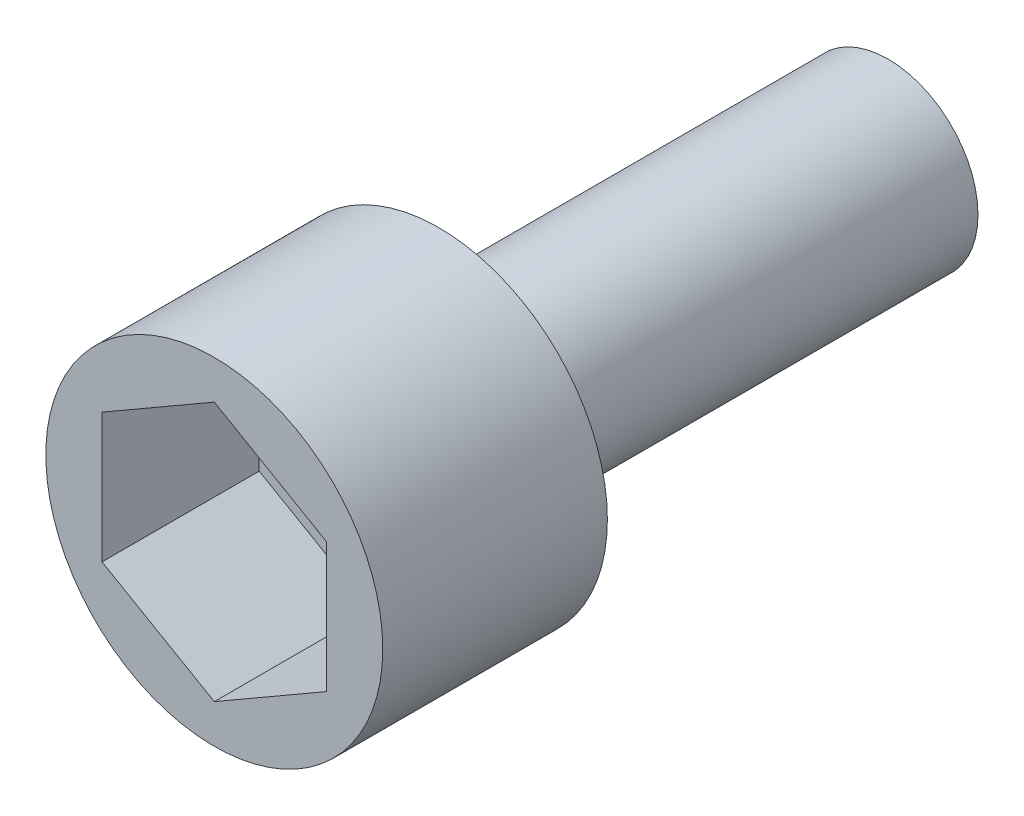
ISO-10303-21;
HEADER;
FILE_DESCRIPTION(('STEP AP214'),'2;1');
FILE_NAME('part.step','',(''),(''),'','','');
FILE_SCHEMA(('AUTOMOTIVE_DESIGN { 1 0 10303 214 1 1 1 1 }'));
ENDSEC;
DATA;
#1=APPLICATION_CONTEXT('core data for automotive mechanical design processes');
#2=APPLICATION_PROTOCOL_DEFINITION('international standard','automotive_design',2000,#1);
#3=PRODUCT_CONTEXT('',#1,'mechanical');
#4=PRODUCT('Part','Part','',(#3));
#5=PRODUCT_RELATED_PRODUCT_CATEGORY('part','',(#4));
#6=PRODUCT_DEFINITION_FORMATION('','',#4);
#7=PRODUCT_DEFINITION_CONTEXT('part definition',#1,'design');
#8=PRODUCT_DEFINITION('design','',#6,#7);
#9=PRODUCT_DEFINITION_SHAPE('','',#8);
#10=(LENGTH_UNIT() NAMED_UNIT(*) SI_UNIT(.MILLI.,.METRE.));
#11=(NAMED_UNIT(*) PLANE_ANGLE_UNIT() SI_UNIT($,.RADIAN.));
#12=(NAMED_UNIT(*) SI_UNIT($,.STERADIAN.) SOLID_ANGLE_UNIT());
#13=UNCERTAINTY_MEASURE_WITH_UNIT(LENGTH_MEASURE(1.E-05),#10,'distance_accuracy_value','');
#14=(GEOMETRIC_REPRESENTATION_CONTEXT(3) GLOBAL_UNCERTAINTY_ASSIGNED_CONTEXT((#13)) GLOBAL_UNIT_ASSIGNED_CONTEXT((#10,
#11,#12)) REPRESENTATION_CONTEXT('',''));
#15=CARTESIAN_POINT('',(0.,0.,0.));
#16=DIRECTION('',(0.,0.,1.));
#17=DIRECTION('',(1.,0.,0.));
#18=AXIS2_PLACEMENT_3D('',#15,#16,#17);
#19=CARTESIAN_POINT('',(0.,0.,10.));
#20=DIRECTION('',(0.,0.,-1.));
#21=DIRECTION('',(-1.,0.,0.));
#22=AXIS2_PLACEMENT_3D('',#19,#20,#21);
#23=CYLINDRICAL_SURFACE('',#22,7.5);
#24=CARTESIAN_POINT('',(0.,0.,10.));
#25=DIRECTION('',(0.,0.,1.));
#26=DIRECTION('',(1.,0.,0.));
#27=AXIS2_PLACEMENT_3D('',#24,#25,#26);
#28=CIRCLE('',#27,7.5);
#29=CARTESIAN_POINT('',(7.5,0.,10.));
#30=VERTEX_POINT('',#29);
#31=EDGE_CURVE('E54',#30,#30,#28,.T.);
#32=ORIENTED_EDGE('',*,*,#31,.F.);
#33=EDGE_LOOP('',(#32));
#34=FACE_BOUND('',#33,.T.);
#35=CARTESIAN_POINT('',(0.,0.,0.));
#36=DIRECTION('',(0.,0.,1.));
#37=DIRECTION('',(1.,0.,0.));
#38=AXIS2_PLACEMENT_3D('',#35,#36,#37);
#39=CIRCLE('',#38,7.5);
#40=CARTESIAN_POINT('',(7.5,0.,0.));
#41=VERTEX_POINT('',#40);
#42=EDGE_CURVE('E48',#41,#41,#39,.T.);
#43=ORIENTED_EDGE('',*,*,#42,.T.);
#44=EDGE_LOOP('',(#43));
#45=FACE_BOUND('',#44,.T.);
#46=ADVANCED_FACE('F45',(#34,#45),#23,.T.);
#47=CARTESIAN_POINT('',(0.,0.,10.));
#48=DIRECTION('',(0.,0.,1.));
#49=DIRECTION('',(1.,0.,0.));
#50=AXIS2_PLACEMENT_3D('',#47,#48,#49);
#51=PLANE('',#50);
#52=DIRECTION('',(0.,1.,0.));
#53=VECTOR('',#52,1.);
#54=CARTESIAN_POINT('',(5.,-2.88675134594813,10.));
#55=LINE('',#54,#53);
#56=CARTESIAN_POINT('',(5.,-2.88675134594813,10.));
#57=VERTEX_POINT('',#56);
#58=CARTESIAN_POINT('',(5.,2.88675134594813,10.));
#59=VERTEX_POINT('',#58);
#60=EDGE_CURVE('E62',#57,#59,#55,.T.);
#61=ORIENTED_EDGE('',*,*,#60,.F.);
#62=DIRECTION('',(0.866025403784439,0.5,0.));
#63=VECTOR('',#62,1.);
#64=CARTESIAN_POINT('',(0.,-5.77350269189626,10.));
#65=LINE('',#64,#63);
#66=CARTESIAN_POINT('',(0.,-5.77350269189626,10.));
#67=VERTEX_POINT('',#66);
#68=EDGE_CURVE('E155',#67,#57,#65,.T.);
#69=ORIENTED_EDGE('',*,*,#68,.F.);
#70=DIRECTION('',(0.866025403784438,-0.5,0.));
#71=VECTOR('',#70,1.);
#72=CARTESIAN_POINT('',(-5.,-2.88675134594813,10.));
#73=LINE('',#72,#71);
#74=CARTESIAN_POINT('',(-5.,-2.88675134594813,10.));
#75=VERTEX_POINT('',#74);
#76=EDGE_CURVE('E152',#75,#67,#73,.T.);
#77=ORIENTED_EDGE('',*,*,#76,.F.);
#78=DIRECTION('',(0.,-1.,0.));
#79=VECTOR('',#78,1.);
#80=CARTESIAN_POINT('',(-5.,2.88675134594813,10.));
#81=LINE('',#80,#79);
#82=CARTESIAN_POINT('',(-5.,2.88675134594813,10.));
#83=VERTEX_POINT('',#82);
#84=EDGE_CURVE('E110',#83,#75,#81,.T.);
#85=ORIENTED_EDGE('',*,*,#84,.F.);
#86=DIRECTION('',(-0.866025403784439,-0.5,0.));
#87=VECTOR('',#86,1.);
#88=CARTESIAN_POINT('',(0.,5.77350269189626,10.));
#89=LINE('',#88,#87);
#90=CARTESIAN_POINT('',(0.,5.77350269189626,10.));
#91=VERTEX_POINT('',#90);
#92=EDGE_CURVE('E146',#91,#83,#89,.T.);
#93=ORIENTED_EDGE('',*,*,#92,.F.);
#94=DIRECTION('',(-0.866025403784439,0.5,0.));
#95=VECTOR('',#94,1.);
#96=CARTESIAN_POINT('',(5.,2.88675134594813,10.));
#97=LINE('',#96,#95);
#98=EDGE_CURVE('E142',#59,#91,#97,.T.);
#99=ORIENTED_EDGE('',*,*,#98,.F.);
#100=EDGE_LOOP('',(#61,#69,#77,#85,#93,#99));
#101=FACE_BOUND('',#100,.T.);
#102=ORIENTED_EDGE('',*,*,#31,.T.);
#103=EDGE_LOOP('',(#102));
#104=FACE_BOUND('',#103,.T.);
#105=ADVANCED_FACE('F185',(#101,#104),#51,.T.);
#106=CARTESIAN_POINT('',(0.,0.,0.));
#107=DIRECTION('',(0.,0.,1.));
#108=DIRECTION('',(1.,0.,0.));
#109=AXIS2_PLACEMENT_3D('',#106,#107,#108);
#110=PLANE('',#109);
#111=CARTESIAN_POINT('',(0.,0.,0.));
#112=DIRECTION('',(0.,0.,-1.));
#113=DIRECTION('',(-1.,0.,0.));
#114=AXIS2_PLACEMENT_3D('',#111,#112,#113);
#115=CIRCLE('',#114,4.);
#116=CARTESIAN_POINT('',(-4.,0.,0.));
#117=VERTEX_POINT('',#116);
#118=EDGE_CURVE('E11',#117,#117,#115,.T.);
#119=ORIENTED_EDGE('',*,*,#118,.F.);
#120=EDGE_LOOP('',(#119));
#121=FACE_BOUND('',#120,.T.);
#122=ORIENTED_EDGE('',*,*,#42,.F.);
#123=EDGE_LOOP('',(#122));
#124=FACE_BOUND('',#123,.T.);
#125=ADVANCED_FACE('F182',(#121,#124),#110,.F.);
#126=CARTESIAN_POINT('',(0.,0.,-20.));
#127=DIRECTION('',(0.,0.,1.));
#128=DIRECTION('',(1.,0.,0.));
#129=AXIS2_PLACEMENT_3D('',#126,#127,#128);
#130=CYLINDRICAL_SURFACE('',#129,4.);
#131=CARTESIAN_POINT('',(0.,0.,-20.));
#132=DIRECTION('',(0.,0.,-1.));
#133=DIRECTION('',(-1.,0.,0.));
#134=AXIS2_PLACEMENT_3D('',#131,#132,#133);
#135=CIRCLE('',#134,4.);
#136=CARTESIAN_POINT('',(-4.,0.,-20.));
#137=VERTEX_POINT('',#136);
#138=EDGE_CURVE('E161',#137,#137,#135,.T.);
#139=ORIENTED_EDGE('',*,*,#138,.F.);
#140=EDGE_LOOP('',(#139));
#141=FACE_BOUND('',#140,.T.);
#142=ORIENTED_EDGE('',*,*,#118,.T.);
#143=EDGE_LOOP('',(#142));
#144=FACE_BOUND('',#143,.T.);
#145=ADVANCED_FACE('F184',(#141,#144),#130,.T.);
#146=CARTESIAN_POINT('',(0.,0.,-20.));
#147=DIRECTION('',(0.,0.,-1.));
#148=DIRECTION('',(-1.,0.,0.));
#149=AXIS2_PLACEMENT_3D('',#146,#147,#148);
#150=PLANE('',#149);
#151=ORIENTED_EDGE('',*,*,#138,.T.);
#152=EDGE_LOOP('',(#151));
#153=FACE_BOUND('',#152,.T.);
#154=ADVANCED_FACE('F191',(#153),#150,.T.);
#155=CARTESIAN_POINT('',(5.,-2.88675134594813,3.));
#156=DIRECTION('',(1.,0.,0.));
#157=DIRECTION('',(0.,0.,-1.));
#158=AXIS2_PLACEMENT_3D('',#155,#156,#157);
#159=PLANE('',#158);
#160=ORIENTED_EDGE('',*,*,#60,.T.);
#161=DIRECTION('',(0.,0.,1.));
#162=VECTOR('',#161,1.);
#163=CARTESIAN_POINT('',(5.,2.88675134594813,3.));
#164=LINE('',#163,#162);
#165=CARTESIAN_POINT('',(5.,2.88675134594813,3.));
#166=VERTEX_POINT('',#165);
#167=EDGE_CURVE('E92',#166,#59,#164,.T.);
#168=ORIENTED_EDGE('',*,*,#167,.F.);
#169=DIRECTION('',(0.,1.,0.));
#170=VECTOR('',#169,1.);
#171=CARTESIAN_POINT('',(5.,-2.88675134594813,3.));
#172=LINE('',#171,#170);
#173=CARTESIAN_POINT('',(5.,-2.88675134594813,3.));
#174=VERTEX_POINT('',#173);
#175=EDGE_CURVE('E158',#174,#166,#172,.T.);
#176=ORIENTED_EDGE('',*,*,#175,.F.);
#177=DIRECTION('',(0.,0.,1.));
#178=VECTOR('',#177,1.);
#179=CARTESIAN_POINT('',(5.,-2.88675134594813,3.));
#180=LINE('',#179,#178);
#181=EDGE_CURVE('E70',#174,#57,#180,.T.);
#182=ORIENTED_EDGE('',*,*,#181,.T.);
#183=EDGE_LOOP('',(#160,#168,#176,#182));
#184=FACE_BOUND('',#183,.T.);
#185=ADVANCED_FACE('F228',(#184),#159,.F.);
#186=CARTESIAN_POINT('',(0.,-5.77350269189626,3.));
#187=DIRECTION('',(0.5,-0.866025403784439,0.));
#188=DIRECTION('',(0.866025403784439,0.5,0.));
#189=AXIS2_PLACEMENT_3D('',#186,#187,#188);
#190=PLANE('',#189);
#191=ORIENTED_EDGE('',*,*,#68,.T.);
#192=ORIENTED_EDGE('',*,*,#181,.F.);
#193=DIRECTION('',(0.866025403784439,0.5,0.));
#194=VECTOR('',#193,1.);
#195=CARTESIAN_POINT('',(0.,-5.77350269189626,3.));
#196=LINE('',#195,#194);
#197=CARTESIAN_POINT('',(0.,-5.77350269189626,3.));
#198=VERTEX_POINT('',#197);
#199=EDGE_CURVE('E124',#198,#174,#196,.T.);
#200=ORIENTED_EDGE('',*,*,#199,.F.);
#201=DIRECTION('',(0.,0.,1.));
#202=VECTOR('',#201,1.);
#203=CARTESIAN_POINT('',(0.,-5.77350269189626,3.));
#204=LINE('',#203,#202);
#205=EDGE_CURVE('E115',#198,#67,#204,.T.);
#206=ORIENTED_EDGE('',*,*,#205,.T.);
#207=EDGE_LOOP('',(#191,#192,#200,#206));
#208=FACE_BOUND('',#207,.T.);
#209=ADVANCED_FACE('F237',(#208),#190,.F.);
#210=CARTESIAN_POINT('',(-5.,-2.88675134594813,3.));
#211=DIRECTION('',(-0.5,-0.866025403784438,0.));
#212=DIRECTION('',(0.866025403784438,-0.5,0.));
#213=AXIS2_PLACEMENT_3D('',#210,#211,#212);
#214=PLANE('',#213);
#215=ORIENTED_EDGE('',*,*,#76,.T.);
#216=ORIENTED_EDGE('',*,*,#205,.F.);
#217=DIRECTION('',(0.866025403784438,-0.5,0.));
#218=VECTOR('',#217,1.);
#219=CARTESIAN_POINT('',(-5.,-2.88675134594813,3.));
#220=LINE('',#219,#218);
#221=CARTESIAN_POINT('',(-5.,-2.88675134594813,3.));
#222=VERTEX_POINT('',#221);
#223=EDGE_CURVE('E119',#222,#198,#220,.T.);
#224=ORIENTED_EDGE('',*,*,#223,.F.);
#225=DIRECTION('',(0.,0.,1.));
#226=VECTOR('',#225,1.);
#227=CARTESIAN_POINT('',(-5.,-2.88675134594813,3.));
#228=LINE('',#227,#226);
#229=EDGE_CURVE('E103',#222,#75,#228,.T.);
#230=ORIENTED_EDGE('',*,*,#229,.T.);
#231=EDGE_LOOP('',(#215,#216,#224,#230));
#232=FACE_BOUND('',#231,.T.);
#233=ADVANCED_FACE('F120',(#232),#214,.F.);
#234=CARTESIAN_POINT('',(-5.,2.88675134594813,3.));
#235=DIRECTION('',(-1.,0.,0.));
#236=DIRECTION('',(0.,-1.,0.));
#237=AXIS2_PLACEMENT_3D('',#234,#235,#236);
#238=PLANE('',#237);
#239=ORIENTED_EDGE('',*,*,#84,.T.);
#240=ORIENTED_EDGE('',*,*,#229,.F.);
#241=DIRECTION('',(0.,-1.,0.));
#242=VECTOR('',#241,1.);
#243=CARTESIAN_POINT('',(-5.,2.88675134594813,3.));
#244=LINE('',#243,#242);
#245=CARTESIAN_POINT('',(-5.,2.88675134594813,3.));
#246=VERTEX_POINT('',#245);
#247=EDGE_CURVE('E107',#246,#222,#244,.T.);
#248=ORIENTED_EDGE('',*,*,#247,.F.);
#249=DIRECTION('',(0.,0.,1.));
#250=VECTOR('',#249,1.);
#251=CARTESIAN_POINT('',(-5.,2.88675134594813,3.));
#252=LINE('',#251,#250);
#253=EDGE_CURVE('E116',#246,#83,#252,.T.);
#254=ORIENTED_EDGE('',*,*,#253,.T.);
#255=EDGE_LOOP('',(#239,#240,#248,#254));
#256=FACE_BOUND('',#255,.T.);
#257=ADVANCED_FACE('F105',(#256),#238,.F.);
#258=CARTESIAN_POINT('',(0.,5.77350269189626,3.));
#259=DIRECTION('',(-0.5,0.866025403784439,0.));
#260=DIRECTION('',(-0.866025403784439,-0.5,0.));
#261=AXIS2_PLACEMENT_3D('',#258,#259,#260);
#262=PLANE('',#261);
#263=ORIENTED_EDGE('',*,*,#92,.T.);
#264=ORIENTED_EDGE('',*,*,#253,.F.);
#265=DIRECTION('',(-0.866025403784439,-0.5,0.));
#266=VECTOR('',#265,1.);
#267=CARTESIAN_POINT('',(0.,5.77350269189626,3.));
#268=LINE('',#267,#266);
#269=CARTESIAN_POINT('',(0.,5.77350269189626,3.));
#270=VERTEX_POINT('',#269);
#271=EDGE_CURVE('E130',#270,#246,#268,.T.);
#272=ORIENTED_EDGE('',*,*,#271,.F.);
#273=DIRECTION('',(0.,0.,1.));
#274=VECTOR('',#273,1.);
#275=CARTESIAN_POINT('',(0.,5.77350269189626,3.));
#276=LINE('',#275,#274);
#277=EDGE_CURVE('E166',#270,#91,#276,.T.);
#278=ORIENTED_EDGE('',*,*,#277,.T.);
#279=EDGE_LOOP('',(#263,#264,#272,#278));
#280=FACE_BOUND('',#279,.T.);
#281=ADVANCED_FACE('F262',(#280),#262,.F.);
#282=CARTESIAN_POINT('',(5.,2.88675134594813,3.));
#283=DIRECTION('',(0.5,0.866025403784438,0.));
#284=DIRECTION('',(-0.866025403784439,0.5,0.));
#285=AXIS2_PLACEMENT_3D('',#282,#283,#284);
#286=PLANE('',#285);
#287=ORIENTED_EDGE('',*,*,#98,.T.);
#288=ORIENTED_EDGE('',*,*,#277,.F.);
#289=DIRECTION('',(-0.866025403784439,0.5,0.));
#290=VECTOR('',#289,1.);
#291=CARTESIAN_POINT('',(5.,2.88675134594813,3.));
#292=LINE('',#291,#290);
#293=EDGE_CURVE('E134',#166,#270,#292,.T.);
#294=ORIENTED_EDGE('',*,*,#293,.F.);
#295=ORIENTED_EDGE('',*,*,#167,.T.);
#296=EDGE_LOOP('',(#287,#288,#294,#295));
#297=FACE_BOUND('',#296,.T.);
#298=ADVANCED_FACE('F271',(#297),#286,.F.);
#299=CARTESIAN_POINT('',(0.,0.,3.));
#300=DIRECTION('',(0.,0.,1.));
#301=DIRECTION('',(1.,0.,0.));
#302=AXIS2_PLACEMENT_3D('',#299,#300,#301);
#303=PLANE('',#302);
#304=ORIENTED_EDGE('',*,*,#175,.T.);
#305=ORIENTED_EDGE('',*,*,#293,.T.);
#306=ORIENTED_EDGE('',*,*,#271,.T.);
#307=ORIENTED_EDGE('',*,*,#247,.T.);
#308=ORIENTED_EDGE('',*,*,#223,.T.);
#309=ORIENTED_EDGE('',*,*,#199,.T.);
#310=EDGE_LOOP('',(#304,#305,#306,#307,#308,#309));
#311=FACE_BOUND('',#310,.T.);
#312=ADVANCED_FACE('F127',(#311),#303,.T.);
#313=CLOSED_SHELL('',(#46,#105,#125,#145,#154,#185,#209,#233,#257,#281,#298,#312));
#314=MANIFOLD_SOLID_BREP('B2',#313);
#315=ADVANCED_BREP_SHAPE_REPRESENTATION('',(#18,#314),#14);
#316=SHAPE_DEFINITION_REPRESENTATION(#9,#315);
ENDSEC;
END-ISO-10303-21;
